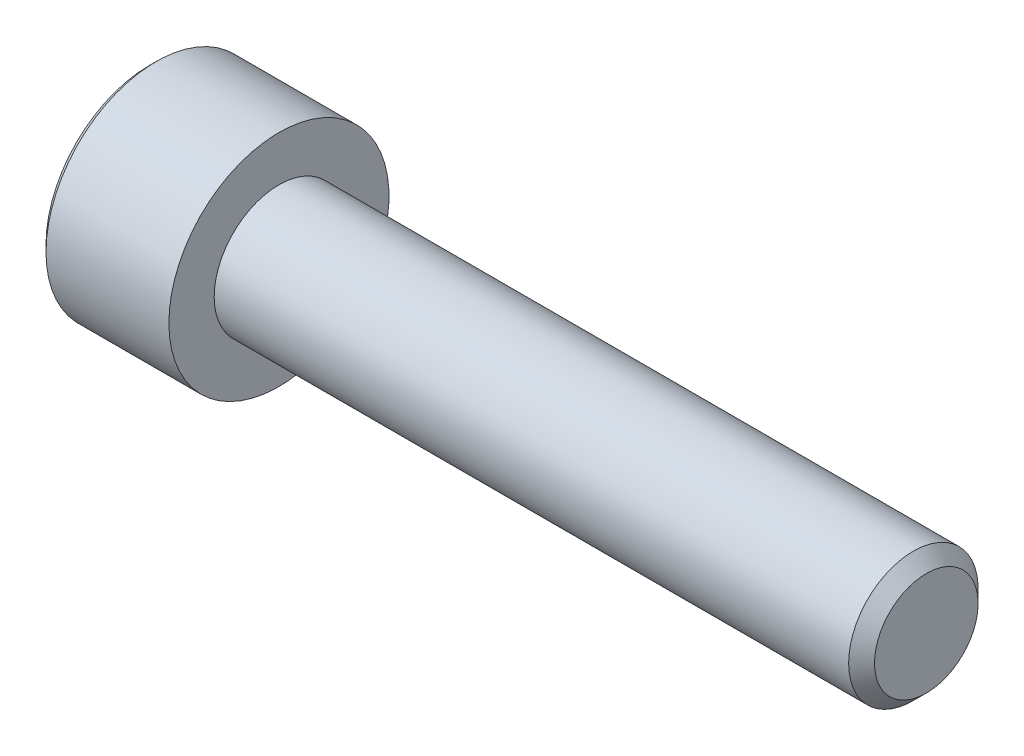
ISO-10303-21;
HEADER;
FILE_DESCRIPTION(('STEP AP214'),'2;1');
FILE_NAME('part.step','',(''),(''),'','','');
FILE_SCHEMA(('AUTOMOTIVE_DESIGN { 1 0 10303 214 1 1 1 1 }'));
ENDSEC;
DATA;
#1=APPLICATION_CONTEXT('core data for automotive mechanical design processes');
#2=APPLICATION_PROTOCOL_DEFINITION('international standard','automotive_design',2000,#1);
#3=PRODUCT_CONTEXT('',#1,'mechanical');
#4=PRODUCT('Part','Part','',(#3));
#5=PRODUCT_RELATED_PRODUCT_CATEGORY('part','',(#4));
#6=PRODUCT_DEFINITION_FORMATION('','',#4);
#7=PRODUCT_DEFINITION_CONTEXT('part definition',#1,'design');
#8=PRODUCT_DEFINITION('design','',#6,#7);
#9=PRODUCT_DEFINITION_SHAPE('','',#8);
#10=(LENGTH_UNIT() NAMED_UNIT(*) SI_UNIT(.MILLI.,.METRE.));
#11=(NAMED_UNIT(*) PLANE_ANGLE_UNIT() SI_UNIT($,.RADIAN.));
#12=(NAMED_UNIT(*) SI_UNIT($,.STERADIAN.) SOLID_ANGLE_UNIT());
#13=UNCERTAINTY_MEASURE_WITH_UNIT(LENGTH_MEASURE(1.E-05),#10,'distance_accuracy_value','');
#14=(GEOMETRIC_REPRESENTATION_CONTEXT(3) GLOBAL_UNCERTAINTY_ASSIGNED_CONTEXT((#13)) GLOBAL_UNIT_ASSIGNED_CONTEXT((#10,
#11,#12)) REPRESENTATION_CONTEXT('',''));
#15=CARTESIAN_POINT('',(0.,0.,0.));
#16=DIRECTION('',(0.,0.,1.));
#17=DIRECTION('',(1.,0.,0.));
#18=AXIS2_PLACEMENT_3D('',#15,#16,#17);
#19=CARTESIAN_POINT('',(0.,0.,0.));
#20=DIRECTION('',(-1.,0.,0.));
#21=DIRECTION('',(0.,0.,1.));
#22=AXIS2_PLACEMENT_3D('',#19,#20,#21);
#23=PLANE('',#22);
#24=CARTESIAN_POINT('',(0.,0.,0.));
#25=DIRECTION('',(-1.,0.,0.));
#26=DIRECTION('',(0.,0.,1.));
#27=AXIS2_PLACEMENT_3D('',#24,#25,#26);
#28=CIRCLE('',#27,1.99999999999999);
#29=CARTESIAN_POINT('',(0.,0.,1.99999999999999));
#30=VERTEX_POINT('',#29);
#31=EDGE_CURVE('E151',#30,#30,#28,.F.);
#32=ORIENTED_EDGE('',*,*,#31,.T.);
#33=EDGE_LOOP('',(#32));
#34=FACE_BOUND('',#33,.T.);
#35=ADVANCED_FACE('F45',(#34),#23,.F.);
#36=CARTESIAN_POINT('',(0.,0.,0.));
#37=DIRECTION('',(-1.,0.,0.));
#38=DIRECTION('',(0.,0.,1.));
#39=AXIS2_PLACEMENT_3D('',#36,#37,#38);
#40=CYLINDRICAL_SURFACE('',#39,2.5);
#41=CARTESIAN_POINT('',(-0.500000000000006,0.,0.));
#42=DIRECTION('',(-1.,0.,0.));
#43=DIRECTION('',(0.,0.,1.));
#44=AXIS2_PLACEMENT_3D('',#41,#42,#43);
#45=CIRCLE('',#44,2.5);
#46=CARTESIAN_POINT('',(-0.500000000000006,0.,2.5));
#47=VERTEX_POINT('',#46);
#48=EDGE_CURVE('E147',#47,#47,#45,.T.);
#49=ORIENTED_EDGE('',*,*,#48,.T.);
#50=EDGE_LOOP('',(#49));
#51=FACE_BOUND('',#50,.T.);
#52=CARTESIAN_POINT('',(-25.,0.,0.));
#53=DIRECTION('',(-1.,0.,0.));
#54=DIRECTION('',(0.,0.,1.));
#55=AXIS2_PLACEMENT_3D('',#52,#53,#54);
#56=CIRCLE('',#55,2.5);
#57=CARTESIAN_POINT('',(-25.,0.,2.5));
#58=VERTEX_POINT('',#57);
#59=EDGE_CURVE('E143',#58,#58,#56,.T.);
#60=ORIENTED_EDGE('',*,*,#59,.F.);
#61=EDGE_LOOP('',(#60));
#62=FACE_BOUND('',#61,.T.);
#63=ADVANCED_FACE('F175',(#51,#62),#40,.T.);
#64=CARTESIAN_POINT('',(-25.,2.5,0.));
#65=DIRECTION('',(-1.,0.,0.));
#66=DIRECTION('',(0.,0.,1.));
#67=AXIS2_PLACEMENT_3D('',#64,#65,#66);
#68=PLANE('',#67);
#69=CARTESIAN_POINT('',(-25.,0.,0.));
#70=DIRECTION('',(-1.,0.,0.));
#71=DIRECTION('',(0.,0.,1.));
#72=AXIS2_PLACEMENT_3D('',#69,#70,#71);
#73=CIRCLE('',#72,4.25);
#74=CARTESIAN_POINT('',(-25.,0.,4.25));
#75=VERTEX_POINT('',#74);
#76=EDGE_CURVE('E128',#75,#75,#73,.T.);
#77=ORIENTED_EDGE('',*,*,#76,.F.);
#78=EDGE_LOOP('',(#77));
#79=FACE_BOUND('',#78,.T.);
#80=ORIENTED_EDGE('',*,*,#59,.T.);
#81=EDGE_LOOP('',(#80));
#82=FACE_BOUND('',#81,.T.);
#83=ADVANCED_FACE('F180',(#79,#82),#68,.F.);
#84=CARTESIAN_POINT('',(0.,0.,0.));
#85=DIRECTION('',(-1.,0.,0.));
#86=DIRECTION('',(0.,0.,1.));
#87=AXIS2_PLACEMENT_3D('',#84,#85,#86);
#88=CYLINDRICAL_SURFACE('',#87,4.25);
#89=CARTESIAN_POINT('',(-29.745,0.,0.));
#90=DIRECTION('',(1.,0.,0.));
#91=DIRECTION('',(0.,0.,-1.));
#92=AXIS2_PLACEMENT_3D('',#89,#90,#91);
#93=CIRCLE('',#92,4.25);
#94=CARTESIAN_POINT('',(-29.745,0.,-4.25));
#95=VERTEX_POINT('',#94);
#96=EDGE_CURVE('E11',#95,#95,#93,.T.);
#97=ORIENTED_EDGE('',*,*,#96,.T.);
#98=EDGE_LOOP('',(#97));
#99=FACE_BOUND('',#98,.T.);
#100=ORIENTED_EDGE('',*,*,#76,.T.);
#101=EDGE_LOOP('',(#100));
#102=FACE_BOUND('',#101,.T.);
#103=ADVANCED_FACE('F192',(#99,#102),#88,.T.);
#104=CARTESIAN_POINT('',(-30.,4.25,0.));
#105=DIRECTION('',(1.,0.,0.));
#106=DIRECTION('',(0.,0.,-1.));
#107=AXIS2_PLACEMENT_3D('',#104,#105,#106);
#108=PLANE('',#107);
#109=CARTESIAN_POINT('',(-30.,0.,0.));
#110=DIRECTION('',(1.,0.,0.));
#111=DIRECTION('',(0.,0.,-1.));
#112=AXIS2_PLACEMENT_3D('',#109,#110,#111);
#113=CIRCLE('',#112,3.99499999999999);
#114=CARTESIAN_POINT('',(-30.,0.,-3.99499999999999));
#115=VERTEX_POINT('',#114);
#116=EDGE_CURVE('E54',#115,#115,#113,.F.);
#117=ORIENTED_EDGE('',*,*,#116,.T.);
#118=EDGE_LOOP('',(#117));
#119=FACE_BOUND('',#118,.T.);
#120=DIRECTION('',(0.,-0.5,-0.866025403784439));
#121=VECTOR('',#120,1.);
#122=CARTESIAN_POINT('',(-30.,2.3094010767585,0.));
#123=LINE('',#122,#121);
#124=CARTESIAN_POINT('',(-30.,2.3094010767585,0.));
#125=VERTEX_POINT('',#124);
#126=CARTESIAN_POINT('',(-30.,1.15470053837925,-2.));
#127=VERTEX_POINT('',#126);
#128=EDGE_CURVE('E379',#125,#127,#123,.T.);
#129=ORIENTED_EDGE('',*,*,#128,.F.);
#130=DIRECTION('',(0.,0.5,-0.866025403784439));
#131=VECTOR('',#130,1.);
#132=CARTESIAN_POINT('',(-30.,1.15470053837925,2.));
#133=LINE('',#132,#131);
#134=CARTESIAN_POINT('',(-30.,1.15470053837925,2.));
#135=VERTEX_POINT('',#134);
#136=EDGE_CURVE('E61',#135,#125,#133,.T.);
#137=ORIENTED_EDGE('',*,*,#136,.F.);
#138=DIRECTION('',(0.,1.,0.));
#139=VECTOR('',#138,1.);
#140=CARTESIAN_POINT('',(-30.,-1.15470053837925,2.));
#141=LINE('',#140,#139);
#142=CARTESIAN_POINT('',(-30.,-1.15470053837925,2.));
#143=VERTEX_POINT('',#142);
#144=EDGE_CURVE('E96',#143,#135,#141,.T.);
#145=ORIENTED_EDGE('',*,*,#144,.F.);
#146=DIRECTION('',(0.,0.5,0.866025403784439));
#147=VECTOR('',#146,1.);
#148=CARTESIAN_POINT('',(-30.,-2.3094010767585,0.));
#149=LINE('',#148,#147);
#150=CARTESIAN_POINT('',(-30.,-2.3094010767585,0.));
#151=VERTEX_POINT('',#150);
#152=EDGE_CURVE('E105',#151,#143,#149,.T.);
#153=ORIENTED_EDGE('',*,*,#152,.F.);
#154=DIRECTION('',(0.,-0.5,0.866025403784439));
#155=VECTOR('',#154,1.);
#156=CARTESIAN_POINT('',(-30.,-1.15470053837925,-2.));
#157=LINE('',#156,#155);
#158=CARTESIAN_POINT('',(-30.,-1.15470053837925,-2.));
#159=VERTEX_POINT('',#158);
#160=EDGE_CURVE('E112',#159,#151,#157,.T.);
#161=ORIENTED_EDGE('',*,*,#160,.F.);
#162=DIRECTION('',(0.,-1.,0.));
#163=VECTOR('',#162,1.);
#164=CARTESIAN_POINT('',(-30.,1.15470053837925,-2.));
#165=LINE('',#164,#163);
#166=EDGE_CURVE('E383',#127,#159,#165,.T.);
#167=ORIENTED_EDGE('',*,*,#166,.F.);
#168=EDGE_LOOP('',(#129,#137,#145,#153,#161,#167));
#169=FACE_BOUND('',#168,.T.);
#170=ADVANCED_FACE('F115',(#119,#169),#108,.F.);
#171=CARTESIAN_POINT('',(-0.500000000000006,0.,0.));
#172=DIRECTION('',(-1.,0.,0.));
#173=DIRECTION('',(0.,0.,1.));
#174=AXIS2_PLACEMENT_3D('',#171,#172,#173);
#175=CONICAL_SURFACE('',#174,2.5,0.78539816339745);
#176=ORIENTED_EDGE('',*,*,#31,.F.);
#177=EDGE_LOOP('',(#176));
#178=FACE_BOUND('',#177,.T.);
#179=ORIENTED_EDGE('',*,*,#48,.F.);
#180=EDGE_LOOP('',(#179));
#181=FACE_BOUND('',#180,.T.);
#182=ADVANCED_FACE('F184',(#178,#181),#175,.T.);
#183=CARTESIAN_POINT('',(-27.5,1.15470053837925,2.));
#184=DIRECTION('',(0.,0.866025403784439,0.5));
#185=DIRECTION('',(0.,-0.5,0.866025403784439));
#186=AXIS2_PLACEMENT_3D('',#183,#184,#185);
#187=PLANE('',#186);
#188=ORIENTED_EDGE('',*,*,#136,.T.);
#189=DIRECTION('',(-1.,0.,0.));
#190=VECTOR('',#189,1.);
#191=CARTESIAN_POINT('',(-27.5,2.3094010767585,0.));
#192=LINE('',#191,#190);
#193=CARTESIAN_POINT('',(-27.5,2.3094010767585,0.));
#194=VERTEX_POINT('',#193);
#195=EDGE_CURVE('E137',#194,#125,#192,.T.);
#196=ORIENTED_EDGE('',*,*,#195,.F.);
#197=DIRECTION('',(0.,0.5,-0.866025403784439));
#198=VECTOR('',#197,1.);
#199=CARTESIAN_POINT('',(-27.5,1.15470053837925,2.));
#200=LINE('',#199,#198);
#201=CARTESIAN_POINT('',(-27.5,1.15470053837925,2.));
#202=VERTEX_POINT('',#201);
#203=EDGE_CURVE('E117',#202,#194,#200,.T.);
#204=ORIENTED_EDGE('',*,*,#203,.F.);
#205=DIRECTION('',(-1.,0.,0.));
#206=VECTOR('',#205,1.);
#207=CARTESIAN_POINT('',(-27.5,1.15470053837925,2.));
#208=LINE('',#207,#206);
#209=EDGE_CURVE('E101',#202,#135,#208,.T.);
#210=ORIENTED_EDGE('',*,*,#209,.T.);
#211=EDGE_LOOP('',(#188,#196,#204,#210));
#212=FACE_BOUND('',#211,.T.);
#213=ADVANCED_FACE('F186',(#212),#187,.F.);
#214=CARTESIAN_POINT('',(-27.5,-1.15470053837925,2.));
#215=DIRECTION('',(0.,0.,1.));
#216=DIRECTION('',(0.,-1.,0.));
#217=AXIS2_PLACEMENT_3D('',#214,#215,#216);
#218=PLANE('',#217);
#219=ORIENTED_EDGE('',*,*,#144,.T.);
#220=ORIENTED_EDGE('',*,*,#209,.F.);
#221=DIRECTION('',(0.,1.,0.));
#222=VECTOR('',#221,1.);
#223=CARTESIAN_POINT('',(-27.5,-1.15470053837925,2.));
#224=LINE('',#223,#222);
#225=CARTESIAN_POINT('',(-27.5,-1.15470053837925,2.));
#226=VERTEX_POINT('',#225);
#227=EDGE_CURVE('E98',#226,#202,#224,.T.);
#228=ORIENTED_EDGE('',*,*,#227,.F.);
#229=DIRECTION('',(-1.,0.,0.));
#230=VECTOR('',#229,1.);
#231=CARTESIAN_POINT('',(-27.5,-1.15470053837925,2.));
#232=LINE('',#231,#230);
#233=EDGE_CURVE('E91',#226,#143,#232,.T.);
#234=ORIENTED_EDGE('',*,*,#233,.T.);
#235=EDGE_LOOP('',(#219,#220,#228,#234));
#236=FACE_BOUND('',#235,.T.);
#237=ADVANCED_FACE('F93',(#236),#218,.F.);
#238=CARTESIAN_POINT('',(-27.5,-2.3094010767585,0.));
#239=DIRECTION('',(0.,-0.866025403784439,0.5));
#240=DIRECTION('',(0.,-0.5,-0.866025403784439));
#241=AXIS2_PLACEMENT_3D('',#238,#239,#240);
#242=PLANE('',#241);
#243=ORIENTED_EDGE('',*,*,#152,.T.);
#244=ORIENTED_EDGE('',*,*,#233,.F.);
#245=DIRECTION('',(0.,0.5,0.866025403784439));
#246=VECTOR('',#245,1.);
#247=CARTESIAN_POINT('',(-27.5,-2.3094010767585,0.));
#248=LINE('',#247,#246);
#249=CARTESIAN_POINT('',(-27.5,-2.3094010767585,0.));
#250=VERTEX_POINT('',#249);
#251=EDGE_CURVE('E70',#250,#226,#248,.T.);
#252=ORIENTED_EDGE('',*,*,#251,.F.);
#253=DIRECTION('',(-1.,0.,0.));
#254=VECTOR('',#253,1.);
#255=CARTESIAN_POINT('',(-27.5,-2.3094010767585,0.));
#256=LINE('',#255,#254);
#257=EDGE_CURVE('E102',#250,#151,#256,.T.);
#258=ORIENTED_EDGE('',*,*,#257,.T.);
#259=EDGE_LOOP('',(#243,#244,#252,#258));
#260=FACE_BOUND('',#259,.T.);
#261=ADVANCED_FACE('F106',(#260),#242,.F.);
#262=CARTESIAN_POINT('',(-27.5,-1.15470053837925,-2.));
#263=DIRECTION('',(0.,-0.866025403784439,-0.5));
#264=DIRECTION('',(0.,0.5,-0.866025403784439));
#265=AXIS2_PLACEMENT_3D('',#262,#263,#264);
#266=PLANE('',#265);
#267=ORIENTED_EDGE('',*,*,#160,.T.);
#268=ORIENTED_EDGE('',*,*,#257,.F.);
#269=DIRECTION('',(0.,-0.5,0.866025403784439));
#270=VECTOR('',#269,1.);
#271=CARTESIAN_POINT('',(-27.5,-1.15470053837925,-2.));
#272=LINE('',#271,#270);
#273=CARTESIAN_POINT('',(-27.5,-1.15470053837925,-2.));
#274=VERTEX_POINT('',#273);
#275=EDGE_CURVE('E373',#274,#250,#272,.T.);
#276=ORIENTED_EDGE('',*,*,#275,.F.);
#277=DIRECTION('',(-1.,0.,0.));
#278=VECTOR('',#277,1.);
#279=CARTESIAN_POINT('',(-27.5,-1.15470053837925,-2.));
#280=LINE('',#279,#278);
#281=EDGE_CURVE('E131',#274,#159,#280,.T.);
#282=ORIENTED_EDGE('',*,*,#281,.T.);
#283=EDGE_LOOP('',(#267,#268,#276,#282));
#284=FACE_BOUND('',#283,.T.);
#285=ADVANCED_FACE('F210',(#284),#266,.F.);
#286=CARTESIAN_POINT('',(-27.5,1.15470053837925,-2.));
#287=DIRECTION('',(0.,0.,-1.));
#288=DIRECTION('',(-1.,0.,0.));
#289=AXIS2_PLACEMENT_3D('',#286,#287,#288);
#290=PLANE('',#289);
#291=ORIENTED_EDGE('',*,*,#166,.T.);
#292=ORIENTED_EDGE('',*,*,#281,.F.);
#293=DIRECTION('',(0.,-1.,0.));
#294=VECTOR('',#293,1.);
#295=CARTESIAN_POINT('',(-27.5,1.15470053837925,-2.));
#296=LINE('',#295,#294);
#297=CARTESIAN_POINT('',(-27.5,1.15470053837925,-2.));
#298=VERTEX_POINT('',#297);
#299=EDGE_CURVE('E371',#298,#274,#296,.T.);
#300=ORIENTED_EDGE('',*,*,#299,.F.);
#301=DIRECTION('',(-1.,0.,0.));
#302=VECTOR('',#301,1.);
#303=CARTESIAN_POINT('',(-27.5,1.15470053837925,-2.));
#304=LINE('',#303,#302);
#305=EDGE_CURVE('E134',#298,#127,#304,.T.);
#306=ORIENTED_EDGE('',*,*,#305,.T.);
#307=EDGE_LOOP('',(#291,#292,#300,#306));
#308=FACE_BOUND('',#307,.T.);
#309=ADVANCED_FACE('F170',(#308),#290,.F.);
#310=CARTESIAN_POINT('',(-27.5,2.3094010767585,0.));
#311=DIRECTION('',(0.,0.866025403784439,-0.5));
#312=DIRECTION('',(0.,0.5,0.866025403784439));
#313=AXIS2_PLACEMENT_3D('',#310,#311,#312);
#314=PLANE('',#313);
#315=ORIENTED_EDGE('',*,*,#128,.T.);
#316=ORIENTED_EDGE('',*,*,#305,.F.);
#317=DIRECTION('',(0.,-0.5,-0.866025403784439));
#318=VECTOR('',#317,1.);
#319=CARTESIAN_POINT('',(-27.5,2.3094010767585,0.));
#320=LINE('',#319,#318);
#321=EDGE_CURVE('E123',#194,#298,#320,.T.);
#322=ORIENTED_EDGE('',*,*,#321,.F.);
#323=ORIENTED_EDGE('',*,*,#195,.T.);
#324=EDGE_LOOP('',(#315,#316,#322,#323));
#325=FACE_BOUND('',#324,.T.);
#326=ADVANCED_FACE('F162',(#325),#314,.F.);
#327=CARTESIAN_POINT('',(-30.,0.,0.));
#328=DIRECTION('',(1.,0.,0.));
#329=DIRECTION('',(0.,0.,-1.));
#330=AXIS2_PLACEMENT_3D('',#327,#328,#329);
#331=CONICAL_SURFACE('',#330,3.99499999999999,0.785398163397448);
#332=ORIENTED_EDGE('',*,*,#96,.F.);
#333=EDGE_LOOP('',(#332));
#334=FACE_BOUND('',#333,.T.);
#335=ORIENTED_EDGE('',*,*,#116,.F.);
#336=EDGE_LOOP('',(#335));
#337=FACE_BOUND('',#336,.T.);
#338=ADVANCED_FACE('F47',(#334,#337),#331,.T.);
#339=CARTESIAN_POINT('',(-27.5,-1.15470053837925,-2.));
#340=DIRECTION('',(0.857167300702113,-0.446036056788338,-0.257519037455026));
#341=DIRECTION('',(0.461604487477352,0.887085845417889,0.));
#342=AXIS2_PLACEMENT_3D('',#339,#340,#341);
#343=PLANE('',#342);
#344=ORIENTED_EDGE('',*,*,#275,.T.);
#345=DIRECTION('',(-0.461604487477352,-0.887085845417889,0.));
#346=VECTOR('',#345,1.);
#347=CARTESIAN_POINT('',(-27.027169982274,-1.40074263128796,0.));
#348=LINE('',#347,#346);
#349=CARTESIAN_POINT('',(-26.2982787619449,0.,0.));
#350=VERTEX_POINT('',#349);
#351=EDGE_CURVE('E391',#350,#250,#348,.T.);
#352=ORIENTED_EDGE('',*,*,#351,.F.);
#353=DIRECTION('',(-0.461604487477352,-0.443542922708944,-0.768238877469488));
#354=VECTOR('',#353,1.);
#355=CARTESIAN_POINT('',(-27.027169982274,-0.700371315643979,-1.21307870285923));
#356=LINE('',#355,#354);
#357=EDGE_CURVE('E356',#350,#274,#356,.T.);
#358=ORIENTED_EDGE('',*,*,#357,.T.);
#359=EDGE_LOOP('',(#344,#352,#358));
#360=FACE_BOUND('',#359,.T.);
#361=ADVANCED_FACE('F161',(#360),#343,.F.);
#362=CARTESIAN_POINT('',(-27.5,1.15470053837925,-2.));
#363=DIRECTION('',(0.857167300702113,0.,-0.515038074910052));
#364=DIRECTION('',(-0.515038074910052,0.,-0.857167300702113));
#365=AXIS2_PLACEMENT_3D('',#362,#363,#364);
#366=PLANE('',#365);
#367=ORIENTED_EDGE('',*,*,#299,.T.);
#368=ORIENTED_EDGE('',*,*,#357,.F.);
#369=DIRECTION('',(-0.461604487477352,0.443542922708945,-0.768238877469487));
#370=VECTOR('',#369,1.);
#371=CARTESIAN_POINT('',(-27.027169982274,0.700371315643978,-1.21307870285923));
#372=LINE('',#371,#370);
#373=EDGE_CURVE('E358',#350,#298,#372,.T.);
#374=ORIENTED_EDGE('',*,*,#373,.T.);
#375=EDGE_LOOP('',(#367,#368,#374));
#376=FACE_BOUND('',#375,.T.);
#377=ADVANCED_FACE('F167',(#376),#366,.F.);
#378=CARTESIAN_POINT('',(-27.5,2.3094010767585,0.));
#379=DIRECTION('',(0.857167300702113,0.446036056788338,-0.257519037455026));
#380=DIRECTION('',(-0.461604487477352,0.887085845417889,0.));
#381=AXIS2_PLACEMENT_3D('',#378,#379,#380);
#382=PLANE('',#381);
#383=ORIENTED_EDGE('',*,*,#321,.T.);
#384=ORIENTED_EDGE('',*,*,#373,.F.);
#385=DIRECTION('',(-0.461604487477352,0.887085845417889,0.));
#386=VECTOR('',#385,1.);
#387=CARTESIAN_POINT('',(-27.027169982274,1.40074263128796,0.));
#388=LINE('',#387,#386);
#389=EDGE_CURVE('E343',#350,#194,#388,.T.);
#390=ORIENTED_EDGE('',*,*,#389,.T.);
#391=EDGE_LOOP('',(#383,#384,#390));
#392=FACE_BOUND('',#391,.T.);
#393=ADVANCED_FACE('F221',(#392),#382,.F.);
#394=CARTESIAN_POINT('',(-27.5,1.15470053837925,2.));
#395=DIRECTION('',(0.857167300702113,0.446036056788338,0.257519037455026));
#396=DIRECTION('',(-0.461604487477352,0.887085845417889,0.));
#397=AXIS2_PLACEMENT_3D('',#394,#395,#396);
#398=PLANE('',#397);
#399=ORIENTED_EDGE('',*,*,#203,.T.);
#400=ORIENTED_EDGE('',*,*,#389,.F.);
#401=DIRECTION('',(-0.461604487477352,0.443542922708944,0.768238877469488));
#402=VECTOR('',#401,1.);
#403=CARTESIAN_POINT('',(-27.027169982274,0.700371315643978,1.21307870285923));
#404=LINE('',#403,#402);
#405=EDGE_CURVE('E332',#350,#202,#404,.T.);
#406=ORIENTED_EDGE('',*,*,#405,.T.);
#407=EDGE_LOOP('',(#399,#400,#406));
#408=FACE_BOUND('',#407,.T.);
#409=ADVANCED_FACE('F225',(#408),#398,.F.);
#410=CARTESIAN_POINT('',(-27.5,-1.15470053837925,2.));
#411=DIRECTION('',(0.857167300702113,0.,0.515038074910052));
#412=DIRECTION('',(0.515038074910052,0.,-0.857167300702114));
#413=AXIS2_PLACEMENT_3D('',#410,#411,#412);
#414=PLANE('',#413);
#415=ORIENTED_EDGE('',*,*,#227,.T.);
#416=ORIENTED_EDGE('',*,*,#405,.F.);
#417=DIRECTION('',(-0.461604487477352,-0.443542922708945,0.768238877469488));
#418=VECTOR('',#417,1.);
#419=CARTESIAN_POINT('',(-27.027169982274,-0.700371315643978,1.21307870285923));
#420=LINE('',#419,#418);
#421=EDGE_CURVE('E333',#350,#226,#420,.T.);
#422=ORIENTED_EDGE('',*,*,#421,.T.);
#423=EDGE_LOOP('',(#415,#416,#422));
#424=FACE_BOUND('',#423,.T.);
#425=ADVANCED_FACE('F229',(#424),#414,.F.);
#426=CARTESIAN_POINT('',(-27.5,-2.3094010767585,0.));
#427=DIRECTION('',(0.857167300702113,-0.446036056788338,0.257519037455026));
#428=DIRECTION('',(0.461604487477352,0.887085845417889,0.));
#429=AXIS2_PLACEMENT_3D('',#426,#427,#428);
#430=PLANE('',#429);
#431=ORIENTED_EDGE('',*,*,#251,.T.);
#432=ORIENTED_EDGE('',*,*,#421,.F.);
#433=ORIENTED_EDGE('',*,*,#351,.T.);
#434=EDGE_LOOP('',(#431,#432,#433));
#435=FACE_BOUND('',#434,.T.);
#436=ADVANCED_FACE('F233',(#435),#430,.F.);
#437=CLOSED_SHELL('',(#35,#63,#83,#103,#170,#182,#213,#237,#261,#285,#309,#326,#338,#361,#377,
#393,#409,#425,#436));
#438=MANIFOLD_SOLID_BREP('B2',#437);
#439=ADVANCED_BREP_SHAPE_REPRESENTATION('',(#18,#438),#14);
#440=SHAPE_DEFINITION_REPRESENTATION(#9,#439);
ENDSEC;
END-ISO-10303-21;
